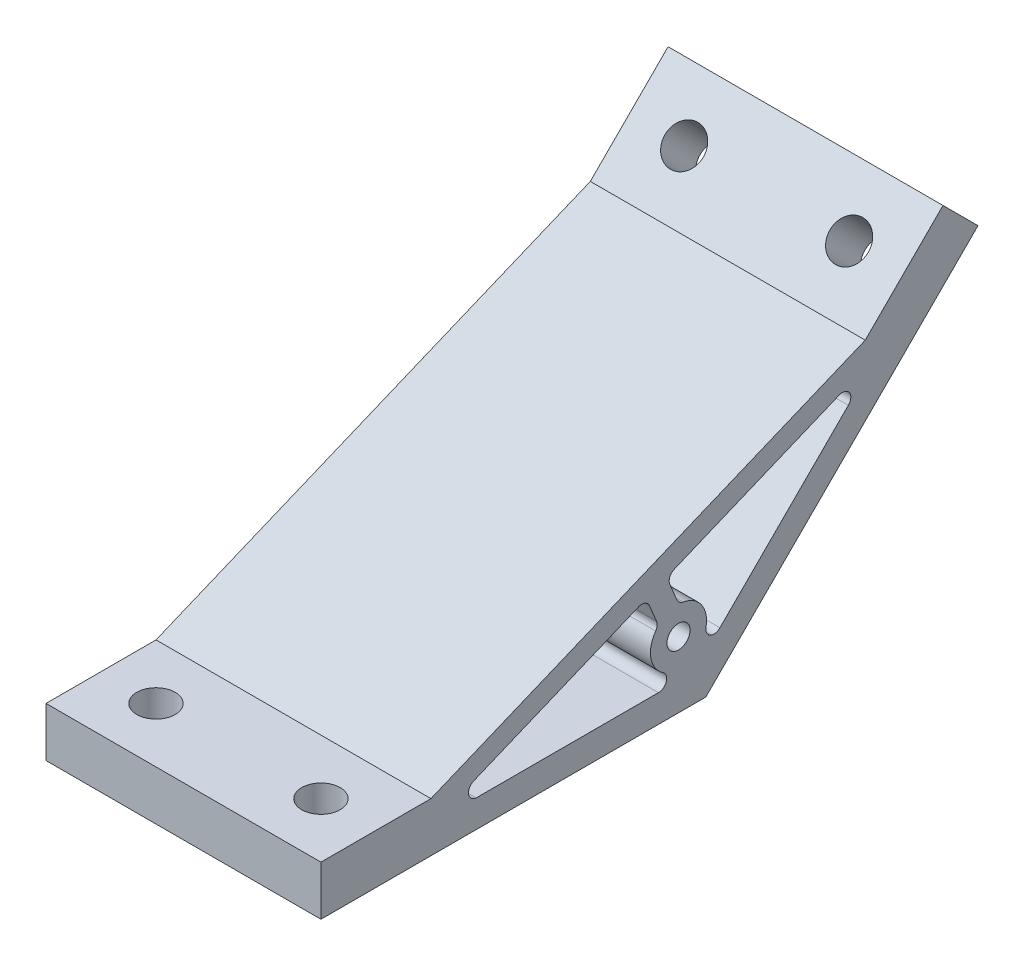
ISO-10303-21;
HEADER;
FILE_DESCRIPTION(('STEP AP214'),'2;1');
FILE_NAME('part.step','',(''),(''),'','','');
FILE_SCHEMA(('AUTOMOTIVE_DESIGN { 1 0 10303 214 1 1 1 1 }'));
ENDSEC;
DATA;
#1=APPLICATION_CONTEXT('core data for automotive mechanical design processes');
#2=APPLICATION_PROTOCOL_DEFINITION('international standard','automotive_design',2000,#1);
#3=PRODUCT_CONTEXT('',#1,'mechanical');
#4=PRODUCT('Part','Part','',(#3));
#5=PRODUCT_RELATED_PRODUCT_CATEGORY('part','',(#4));
#6=PRODUCT_DEFINITION_FORMATION('','',#4);
#7=PRODUCT_DEFINITION_CONTEXT('part definition',#1,'design');
#8=PRODUCT_DEFINITION('design','',#6,#7);
#9=PRODUCT_DEFINITION_SHAPE('','',#8);
#10=(LENGTH_UNIT() NAMED_UNIT(*) SI_UNIT(.MILLI.,.METRE.));
#11=(NAMED_UNIT(*) PLANE_ANGLE_UNIT() SI_UNIT($,.RADIAN.));
#12=(NAMED_UNIT(*) SI_UNIT($,.STERADIAN.) SOLID_ANGLE_UNIT());
#13=UNCERTAINTY_MEASURE_WITH_UNIT(LENGTH_MEASURE(1.E-05),#10,'distance_accuracy_value','');
#14=(GEOMETRIC_REPRESENTATION_CONTEXT(3) GLOBAL_UNCERTAINTY_ASSIGNED_CONTEXT((#13)) GLOBAL_UNIT_ASSIGNED_CONTEXT((#10,
#11,#12)) REPRESENTATION_CONTEXT('',''));
#15=CARTESIAN_POINT('',(0.,0.,0.));
#16=DIRECTION('',(0.,0.,1.));
#17=DIRECTION('',(1.,0.,0.));
#18=AXIS2_PLACEMENT_3D('',#15,#16,#17);
#19=CARTESIAN_POINT('',(25.,0.,0.));
#20=DIRECTION('',(0.,0.707106781186548,0.707106781186548));
#21=DIRECTION('',(0.,-0.707106781186548,0.707106781186548));
#22=AXIS2_PLACEMENT_3D('',#19,#20,#21);
#23=PLANE('',#22);
#24=CARTESIAN_POINT('',(15.,42.426406871193,-42.426406871193));
#25=DIRECTION('',(0.,0.707106781186548,0.707106781186548));
#26=DIRECTION('',(0.,-0.707106781186548,0.707106781186548));
#27=AXIS2_PLACEMENT_3D('',#24,#25,#26);
#28=CIRCLE('',#27,3.50000000000012);
#29=CARTESIAN_POINT('',(15.,39.95153313704,-39.95153313704));
#30=VERTEX_POINT('',#29);
#31=EDGE_CURVE('E481',#30,#30,#28,.T.);
#32=ORIENTED_EDGE('',*,*,#31,.T.);
#33=EDGE_LOOP('',(#32));
#34=FACE_BOUND('',#33,.T.);
#35=DIRECTION('',(-1.,0.,0.));
#36=VECTOR('',#35,1.);
#37=CARTESIAN_POINT('',(25.,0.,0.));
#38=LINE('',#37,#36);
#39=CARTESIAN_POINT('',(25.,0.,0.));
#40=VERTEX_POINT('',#39);
#41=CARTESIAN_POINT('',(-25.,0.,0.));
#42=VERTEX_POINT('',#41);
#43=EDGE_CURVE('E43',#40,#42,#38,.T.);
#44=ORIENTED_EDGE('',*,*,#43,.T.);
#45=DIRECTION('',(0.,0.707106781186548,-0.707106781186548));
#46=VECTOR('',#45,1.);
#47=CARTESIAN_POINT('',(-25.,0.,0.));
#48=LINE('',#47,#46);
#49=CARTESIAN_POINT('',(-25.,49.497474683058,-49.497474683058));
#50=VERTEX_POINT('',#49);
#51=EDGE_CURVE('E269',#42,#50,#48,.T.);
#52=ORIENTED_EDGE('',*,*,#51,.T.);
#53=DIRECTION('',(-1.,0.,0.));
#54=VECTOR('',#53,1.);
#55=CARTESIAN_POINT('',(25.,49.497474683058,-49.497474683058));
#56=LINE('',#55,#54);
#57=CARTESIAN_POINT('',(25.,49.497474683058,-49.497474683058));
#58=VERTEX_POINT('',#57);
#59=EDGE_CURVE('E367',#58,#50,#56,.T.);
#60=ORIENTED_EDGE('',*,*,#59,.F.);
#61=DIRECTION('',(0.,0.707106781186548,-0.707106781186548));
#62=VECTOR('',#61,1.);
#63=CARTESIAN_POINT('',(25.,0.,0.));
#64=LINE('',#63,#62);
#65=EDGE_CURVE('E349',#40,#58,#64,.T.);
#66=ORIENTED_EDGE('',*,*,#65,.F.);
#67=EDGE_LOOP('',(#44,#52,#60,#66));
#68=FACE_BOUND('',#67,.T.);
#69=CARTESIAN_POINT('',(-15.,42.426406871193,-42.426406871193));
#70=DIRECTION('',(0.,0.707106781186548,0.707106781186548));
#71=DIRECTION('',(0.,-0.707106781186548,0.707106781186548));
#72=AXIS2_PLACEMENT_3D('',#69,#70,#71);
#73=CIRCLE('',#72,3.50000000000012);
#74=CARTESIAN_POINT('',(-15.,39.95153313704,-39.95153313704));
#75=VERTEX_POINT('',#74);
#76=EDGE_CURVE('E486',#75,#75,#73,.T.);
#77=ORIENTED_EDGE('',*,*,#76,.T.);
#78=EDGE_LOOP('',(#77));
#79=FACE_BOUND('',#78,.T.);
#80=ADVANCED_FACE('F35',(#34,#68,#79),#23,.F.);
#81=CARTESIAN_POINT('',(25.,55.861435713737,-43.133513652379));
#82=DIRECTION('',(0.,-0.707106781186548,-0.707106781186547));
#83=DIRECTION('',(0.,0.707106781186547,-0.707106781186548));
#84=AXIS2_PLACEMENT_3D('',#81,#82,#83);
#85=PLANE('',#84);
#86=CARTESIAN_POINT('',(15.,48.790367901872,-36.062445840514));
#87=DIRECTION('',(0.,0.707106781186548,0.707106781186548));
#88=DIRECTION('',(0.,-0.707106781186548,0.707106781186548));
#89=AXIS2_PLACEMENT_3D('',#86,#87,#88);
#90=CIRCLE('',#89,3.50000000000012);
#91=CARTESIAN_POINT('',(15.,46.315494167719,-33.587572106361));
#92=VERTEX_POINT('',#91);
#93=EDGE_CURVE('E476',#92,#92,#90,.T.);
#94=ORIENTED_EDGE('',*,*,#93,.F.);
#95=EDGE_LOOP('',(#94));
#96=FACE_BOUND('',#95,.T.);
#97=DIRECTION('',(-1.,0.,0.));
#98=VECTOR('',#97,1.);
#99=CARTESIAN_POINT('',(25.,55.861435713737,-43.133513652379));
#100=LINE('',#99,#98);
#101=CARTESIAN_POINT('',(25.,55.861435713737,-43.133513652379));
#102=VERTEX_POINT('',#101);
#103=CARTESIAN_POINT('',(-25.,55.861435713737,-43.133513652379));
#104=VERTEX_POINT('',#103);
#105=EDGE_CURVE('E365',#102,#104,#100,.T.);
#106=ORIENTED_EDGE('',*,*,#105,.T.);
#107=DIRECTION('',(0.,-0.707106781186547,0.707106781186548));
#108=VECTOR('',#107,1.);
#109=CARTESIAN_POINT('',(-25.,55.861435713737,-43.133513652379));
#110=LINE('',#109,#108);
#111=CARTESIAN_POINT('',(-25.,41.719300090007,-28.991378028649));
#112=VERTEX_POINT('',#111);
#113=EDGE_CURVE('E275',#104,#112,#110,.T.);
#114=ORIENTED_EDGE('',*,*,#113,.T.);
#115=DIRECTION('',(-1.,0.,0.));
#116=VECTOR('',#115,1.);
#117=CARTESIAN_POINT('',(25.,41.719300090007,-28.991378028649));
#118=LINE('',#117,#116);
#119=CARTESIAN_POINT('',(25.,41.719300090007,-28.991378028649));
#120=VERTEX_POINT('',#119);
#121=EDGE_CURVE('E363',#120,#112,#118,.T.);
#122=ORIENTED_EDGE('',*,*,#121,.F.);
#123=DIRECTION('',(0.,-0.707106781186547,0.707106781186548));
#124=VECTOR('',#123,1.);
#125=CARTESIAN_POINT('',(25.,55.861435713737,-43.133513652379));
#126=LINE('',#125,#124);
#127=EDGE_CURVE('E353',#102,#120,#126,.T.);
#128=ORIENTED_EDGE('',*,*,#127,.F.);
#129=EDGE_LOOP('',(#106,#114,#122,#128));
#130=FACE_BOUND('',#129,.T.);
#131=CARTESIAN_POINT('',(-15.,48.790367901872,-36.062445840514));
#132=DIRECTION('',(0.,0.707106781186548,0.707106781186548));
#133=DIRECTION('',(0.,-0.707106781186548,0.707106781186548));
#134=AXIS2_PLACEMENT_3D('',#131,#132,#133);
#135=CIRCLE('',#134,3.50000000000012);
#136=CARTESIAN_POINT('',(-15.,46.315494167719,-33.587572106361));
#137=VERTEX_POINT('',#136);
#138=EDGE_CURVE('E483',#137,#137,#135,.T.);
#139=ORIENTED_EDGE('',*,*,#138,.F.);
#140=EDGE_LOOP('',(#139));
#141=FACE_BOUND('',#140,.T.);
#142=ADVANCED_FACE('F398',(#96,#130,#141),#85,.F.);
#143=CARTESIAN_POINT('',(25.,0.,70.));
#144=DIRECTION('',(0.,1.,0.));
#145=DIRECTION('',(0.,0.,1.));
#146=AXIS2_PLACEMENT_3D('',#143,#144,#145);
#147=PLANE('',#146);
#148=CARTESIAN_POINT('',(-15.,0.,60.));
#149=DIRECTION('',(0.,1.,0.));
#150=DIRECTION('',(0.,0.,1.));
#151=AXIS2_PLACEMENT_3D('',#148,#149,#150);
#152=CIRCLE('',#151,3.5);
#153=CARTESIAN_POINT('',(-15.,0.,63.5));
#154=VERTEX_POINT('',#153);
#155=EDGE_CURVE('E219',#154,#154,#152,.T.);
#156=ORIENTED_EDGE('',*,*,#155,.T.);
#157=EDGE_LOOP('',(#156));
#158=FACE_BOUND('',#157,.T.);
#159=DIRECTION('',(-1.,0.,0.));
#160=VECTOR('',#159,1.);
#161=CARTESIAN_POINT('',(25.,0.,70.));
#162=LINE('',#161,#160);
#163=CARTESIAN_POINT('',(25.,0.,70.));
#164=VERTEX_POINT('',#163);
#165=CARTESIAN_POINT('',(-25.,0.,70.));
#166=VERTEX_POINT('',#165);
#167=EDGE_CURVE('E11',#164,#166,#162,.T.);
#168=ORIENTED_EDGE('',*,*,#167,.T.);
#169=DIRECTION('',(0.,0.,-1.));
#170=VECTOR('',#169,1.);
#171=CARTESIAN_POINT('',(-25.,0.,70.));
#172=LINE('',#171,#170);
#173=EDGE_CURVE('E266',#166,#42,#172,.T.);
#174=ORIENTED_EDGE('',*,*,#173,.T.);
#175=ORIENTED_EDGE('',*,*,#43,.F.);
#176=DIRECTION('',(0.,0.,-1.));
#177=VECTOR('',#176,1.);
#178=CARTESIAN_POINT('',(25.,0.,70.));
#179=LINE('',#178,#177);
#180=EDGE_CURVE('E347',#164,#40,#179,.T.);
#181=ORIENTED_EDGE('',*,*,#180,.F.);
#182=EDGE_LOOP('',(#168,#174,#175,#181));
#183=FACE_BOUND('',#182,.T.);
#184=CARTESIAN_POINT('',(15.,0.,60.));
#185=DIRECTION('',(0.,1.,0.));
#186=DIRECTION('',(0.,0.,1.));
#187=AXIS2_PLACEMENT_3D('',#184,#185,#186);
#188=CIRCLE('',#187,3.5);
#189=CARTESIAN_POINT('',(15.,0.,63.5));
#190=VERTEX_POINT('',#189);
#191=EDGE_CURVE('E471',#190,#190,#188,.T.);
#192=ORIENTED_EDGE('',*,*,#191,.T.);
#193=EDGE_LOOP('',(#192));
#194=FACE_BOUND('',#193,.T.);
#195=ADVANCED_FACE('F380',(#158,#183,#194),#147,.F.);
#196=CARTESIAN_POINT('',(25.,9.0000000000001,49.991379634898));
#197=DIRECTION('',(0.,-1.,0.));
#198=DIRECTION('',(0.,0.,-1.));
#199=AXIS2_PLACEMENT_3D('',#196,#197,#198);
#200=PLANE('',#199);
#201=CARTESIAN_POINT('',(-15.,9.,60.));
#202=DIRECTION('',(0.,1.,0.));
#203=DIRECTION('',(0.,0.,1.));
#204=AXIS2_PLACEMENT_3D('',#201,#202,#203);
#205=CIRCLE('',#204,3.5);
#206=CARTESIAN_POINT('',(-15.,9.,63.5));
#207=VERTEX_POINT('',#206);
#208=EDGE_CURVE('E216',#207,#207,#205,.T.);
#209=ORIENTED_EDGE('',*,*,#208,.F.);
#210=EDGE_LOOP('',(#209));
#211=FACE_BOUND('',#210,.T.);
#212=DIRECTION('',(-1.,0.,0.));
#213=VECTOR('',#212,1.);
#214=CARTESIAN_POINT('',(25.,9.0000000000001,49.991379634898));
#215=LINE('',#214,#213);
#216=CARTESIAN_POINT('',(25.,9.0000000000001,49.991379634898));
#217=VERTEX_POINT('',#216);
#218=CARTESIAN_POINT('',(-25.,9.0000000000001,49.991379634898));
#219=VERTEX_POINT('',#218);
#220=EDGE_CURVE('E361',#217,#219,#215,.T.);
#221=ORIENTED_EDGE('',*,*,#220,.T.);
#222=DIRECTION('',(0.,0.,1.));
#223=VECTOR('',#222,1.);
#224=CARTESIAN_POINT('',(-25.,9.0000000000001,49.991379634898));
#225=LINE('',#224,#223);
#226=CARTESIAN_POINT('',(-25.,9.0000000000001,70.));
#227=VERTEX_POINT('',#226);
#228=EDGE_CURVE('E281',#219,#227,#225,.T.);
#229=ORIENTED_EDGE('',*,*,#228,.T.);
#230=DIRECTION('',(-1.,0.,0.));
#231=VECTOR('',#230,1.);
#232=CARTESIAN_POINT('',(25.,9.0000000000001,70.));
#233=LINE('',#232,#231);
#234=CARTESIAN_POINT('',(25.,9.0000000000001,70.));
#235=VERTEX_POINT('',#234);
#236=EDGE_CURVE('E359',#235,#227,#233,.T.);
#237=ORIENTED_EDGE('',*,*,#236,.F.);
#238=DIRECTION('',(0.,0.,1.));
#239=VECTOR('',#238,1.);
#240=CARTESIAN_POINT('',(25.,9.0000000000001,49.991379634898));
#241=LINE('',#240,#239);
#242=EDGE_CURVE('E357',#217,#235,#241,.T.);
#243=ORIENTED_EDGE('',*,*,#242,.F.);
#244=EDGE_LOOP('',(#221,#229,#237,#243));
#245=FACE_BOUND('',#244,.T.);
#246=CARTESIAN_POINT('',(15.,9.,60.));
#247=DIRECTION('',(0.,1.,0.));
#248=DIRECTION('',(0.,0.,1.));
#249=AXIS2_PLACEMENT_3D('',#246,#247,#248);
#250=CIRCLE('',#249,3.5);
#251=CARTESIAN_POINT('',(15.,9.,63.5));
#252=VERTEX_POINT('',#251);
#253=EDGE_CURVE('E469',#252,#252,#250,.T.);
#254=ORIENTED_EDGE('',*,*,#253,.F.);
#255=EDGE_LOOP('',(#254));
#256=FACE_BOUND('',#255,.T.);
#257=ADVANCED_FACE('F389',(#211,#245,#256),#200,.F.);
#258=CARTESIAN_POINT('',(25.,0.,0.));
#259=DIRECTION('',(1.,0.,0.));
#260=DIRECTION('',(0.,0.,-1.));
#261=AXIS2_PLACEMENT_3D('',#258,#259,#260);
#262=PLANE('',#261);
#263=CARTESIAN_POINT('',(25.,12.0000000000009,4.97056274847582));
#264=DIRECTION('',(1.,0.,0.));
#265=DIRECTION('',(0.,0.,-1.));
#266=AXIS2_PLACEMENT_3D('',#263,#264,#265);
#267=CIRCLE('',#266,2.09999999999872);
#268=CARTESIAN_POINT('',(25.,12.0000000000009,2.8705627484771));
#269=VERTEX_POINT('',#268);
#270=EDGE_CURVE('E200',#269,#269,#267,.T.);
#271=ORIENTED_EDGE('',*,*,#270,.F.);
#272=EDGE_LOOP('',(#271));
#273=FACE_BOUND('',#272,.T.);
#274=DIRECTION('',(0.,-1.,0.));
#275=VECTOR('',#274,1.);
#276=CARTESIAN_POINT('',(25.,9.0000000000001,70.));
#277=LINE('',#276,#275);
#278=EDGE_CURVE('E344',#235,#164,#277,.T.);
#279=ORIENTED_EDGE('',*,*,#278,.T.);
#280=ORIENTED_EDGE('',*,*,#180,.T.);
#281=ORIENTED_EDGE('',*,*,#65,.T.);
#282=DIRECTION('',(0.,0.707106781186548,0.707106781186547));
#283=VECTOR('',#282,1.);
#284=CARTESIAN_POINT('',(25.,49.497474683058,-49.497474683058));
#285=LINE('',#284,#283);
#286=EDGE_CURVE('E351',#58,#102,#285,.T.);
#287=ORIENTED_EDGE('',*,*,#286,.T.);
#288=ORIENTED_EDGE('',*,*,#127,.T.);
#289=DIRECTION('',(0.,-0.382719081853924,0.923864765203701));
#290=VECTOR('',#289,1.);
#291=CARTESIAN_POINT('',(25.,41.719300090007,-28.991378028649));
#292=LINE('',#291,#290);
#293=EDGE_CURVE('E355',#120,#217,#292,.T.);
#294=ORIENTED_EDGE('',*,*,#293,.T.);
#295=ORIENTED_EDGE('',*,*,#242,.T.);
#296=EDGE_LOOP('',(#279,#280,#281,#287,#288,#294,#295));
#297=FACE_BOUND('',#296,.T.);
#298=DIRECTION('',(0.,-0.923879532511293,-0.382683432365075));
#299=VECTOR('',#298,1.);
#300=CARTESIAN_POINT('',(25.,21.043679480921,6.5517930426452));
#301=LINE('',#300,#299);
#302=CARTESIAN_POINT('',(25.,21.043679480921,6.5517930426452));
#303=VERTEX_POINT('',#302);
#304=CARTESIAN_POINT('',(25.,17.934966139289,5.2641218150111));
#305=VERTEX_POINT('',#304);
#306=EDGE_CURVE('E315',#303,#305,#301,.T.);
#307=ORIENTED_EDGE('',*,*,#306,.F.);
#308=CARTESIAN_POINT('',(25.,21.617704629469,5.16597374387834));
#309=DIRECTION('',(1.,0.,0.));
#310=DIRECTION('',(0.,0.,-1.));
#311=AXIS2_PLACEMENT_3D('',#308,#309,#310);
#312=CIRCLE('',#311,1.50000000000007);
#313=CARTESIAN_POINT('',(25.,23.003523928236,5.739998892426));
#314=VERTEX_POINT('',#313);
#315=EDGE_CURVE('E313',#314,#303,#312,.T.);
#316=ORIENTED_EDGE('',*,*,#315,.F.);
#317=DIRECTION('',(0.,-0.382683432365076,0.923879532511293));
#318=VECTOR('',#317,1.);
#319=CARTESIAN_POINT('',(25.,35.442444531149,-24.29021192841));
#320=LINE('',#319,#318);
#321=CARTESIAN_POINT('',(25.,35.442444531149,-24.29021192841));
#322=VERTEX_POINT('',#321);
#323=EDGE_CURVE('E327',#322,#314,#320,.T.);
#324=ORIENTED_EDGE('',*,*,#323,.F.);
#325=CARTESIAN_POINT('',(25.,34.0566252323827,-24.8642370769577));
#326=DIRECTION('',(1.,0.,0.));
#327=DIRECTION('',(0.,0.,-1.));
#328=AXIS2_PLACEMENT_3D('',#325,#326,#327);
#329=CIRCLE('',#328,1.49999999999949);
#330=CARTESIAN_POINT('',(25.,32.995965060603,-25.924897248737));
#331=VERTEX_POINT('',#330);
#332=EDGE_CURVE('E325',#331,#322,#329,.T.);
#333=ORIENTED_EDGE('',*,*,#332,.F.);
#334=DIRECTION('',(0.,0.707106781186557,-0.707106781186538));
#335=VECTOR('',#334,1.);
#336=CARTESIAN_POINT('',(25.,9.6299811996021,-2.5589133877367));
#337=LINE('',#336,#335);
#338=CARTESIAN_POINT('',(25.,9.6299811996021,-2.5589133877367));
#339=VERTEX_POINT('',#338);
#340=EDGE_CURVE('E323',#339,#331,#337,.T.);
#341=ORIENTED_EDGE('',*,*,#340,.F.);
#342=CARTESIAN_POINT('',(25.,10.6906413713782,-1.49825321595333));
#343=DIRECTION('',(1.,0.,0.));
#344=DIRECTION('',(0.,0.,-1.));
#345=AXIS2_PLACEMENT_3D('',#342,#343,#344);
#346=CIRCLE('',#345,1.4999999999999);
#347=CARTESIAN_POINT('',(25.,10.988222877886,-0.0280677694928335));
#348=VERTEX_POINT('',#347);
#349=EDGE_CURVE('E321',#348,#339,#346,.T.);
#350=ORIENTED_EDGE('',*,*,#349,.F.);
#351=CARTESIAN_POINT('',(25.,12.0000000000009,4.97056274847582));
#352=DIRECTION('',(-1.,0.,0.));
#353=DIRECTION('',(0.,0.,1.));
#354=AXIS2_PLACEMENT_3D('',#351,#352,#353);
#355=CIRCLE('',#354,5.10000000000026);
#356=CARTESIAN_POINT('',(25.,17.029675086054,4.1265434781155));
#357=VERTEX_POINT('',#356);
#358=EDGE_CURVE('E319',#357,#348,#355,.T.);
#359=ORIENTED_EDGE('',*,*,#358,.F.);
#360=CARTESIAN_POINT('',(25.,18.5089912878329,3.87830251624389));
#361=DIRECTION('',(1.,0.,0.));
#362=DIRECTION('',(0.,0.,-1.));
#363=AXIS2_PLACEMENT_3D('',#360,#361,#362);
#364=CIRCLE('',#363,1.49999999999882);
#365=EDGE_CURVE('E317',#305,#357,#364,.T.);
#366=ORIENTED_EDGE('',*,*,#365,.F.);
#367=EDGE_LOOP('',(#307,#316,#324,#333,#341,#350,#359,#366));
#368=FACE_BOUND('',#367,.T.);
#369=DIRECTION('',(0.,-8.63347131464353E-05,-0.999999996273159));
#370=VECTOR('',#369,1.);
#371=CARTESIAN_POINT('',(25.,5.00286088114,41.755939665809));
#372=LINE('',#371,#370);
#373=CARTESIAN_POINT('',(25.,5.00286088114,41.755939665809));
#374=VERTEX_POINT('',#373);
#375=CARTESIAN_POINT('',(25.,5.0000000111806,8.6189795199452));
#376=VERTEX_POINT('',#375);
#377=EDGE_CURVE('E285',#374,#376,#372,.T.);
#378=ORIENTED_EDGE('',*,*,#377,.F.);
#379=CARTESIAN_POINT('',(25.,6.49999999894205,41.6633412751829));
#380=DIRECTION('',(1.,0.,0.));
#381=DIRECTION('',(0.,0.,-1.));
#382=AXIS2_PLACEMENT_3D('',#379,#380,#381);
#383=CIRCLE('',#382,1.49999999999988);
#384=CARTESIAN_POINT('',(25.,7.8858767775071,42.237227635566));
#385=VERTEX_POINT('',#384);
#386=EDGE_CURVE('E197',#385,#374,#383,.T.);
#387=ORIENTED_EDGE('',*,*,#386,.F.);
#388=DIRECTION('',(0.,-0.382590897435052,0.923917856305333));
#389=VECTOR('',#388,1.);
#390=CARTESIAN_POINT('',(25.,20.359579109558,12.114513279102));
#391=LINE('',#390,#389);
#392=CARTESIAN_POINT('',(25.,20.359579109558,12.114513279102));
#393=VERTEX_POINT('',#392);
#394=EDGE_CURVE('E297',#393,#385,#391,.T.);
#395=ORIENTED_EDGE('',*,*,#394,.F.);
#396=CARTESIAN_POINT('',(25.,18.9389206029112,11.6331304714574));
#397=DIRECTION('',(1.,0.,0.));
#398=DIRECTION('',(0.,0.,-1.));
#399=AXIS2_PLACEMENT_3D('',#396,#397,#398);
#400=CIRCLE('',#399,1.50000000000124);
#401=CARTESIAN_POINT('',(25.,19.512945751461,10.24731117269));
#402=VERTEX_POINT('',#401);
#403=EDGE_CURVE('E295',#402,#393,#400,.T.);
#404=ORIENTED_EDGE('',*,*,#403,.F.);
#405=DIRECTION('',(0.,0.923879532511346,0.382683432364948));
#406=VECTOR('',#405,1.);
#407=CARTESIAN_POINT('',(25.,16.404232409829,8.9596399450564));
#408=LINE('',#407,#406);
#409=CARTESIAN_POINT('',(25.,16.404232409829,8.9596399450564));
#410=VERTEX_POINT('',#409);
#411=EDGE_CURVE('E293',#410,#402,#408,.T.);
#412=ORIENTED_EDGE('',*,*,#411,.F.);
#413=CARTESIAN_POINT('',(25.,15.8302072612781,10.3454592438224));
#414=DIRECTION('',(1.,0.,0.));
#415=DIRECTION('',(0.,0.,-1.));
#416=AXIS2_PLACEMENT_3D('',#413,#414,#415);
#417=CIRCLE('',#416,1.50000000000034);
#418=CARTESIAN_POINT('',(25.,14.959705610989,9.1238918585157));
#419=VERTEX_POINT('',#418);
#420=EDGE_CURVE('E291',#419,#410,#417,.T.);
#421=ORIENTED_EDGE('',*,*,#420,.F.);
#422=CARTESIAN_POINT('',(25.,11.9999766586759,4.97057938184809));
#423=DIRECTION('',(-1.,0.,0.));
#424=DIRECTION('',(0.,0.,1.));
#425=AXIS2_PLACEMENT_3D('',#422,#423,#424);
#426=CIRCLE('',#425,5.10000000000032);
#427=CARTESIAN_POINT('',(25.,7.7563640518819,7.7993162100918));
#428=VERTEX_POINT('',#427);
#429=EDGE_CURVE('E289',#428,#419,#426,.T.);
#430=ORIENTED_EDGE('',*,*,#429,.F.);
#431=CARTESIAN_POINT('',(25.,6.50000000012096,8.61879736877877));
#432=DIRECTION('',(1.,0.,0.));
#433=DIRECTION('',(0.,0.,-1.));
#434=AXIS2_PLACEMENT_3D('',#431,#432,#433);
#435=CIRCLE('',#434,1.50000000000004);
#436=EDGE_CURVE('E287',#376,#428,#435,.T.);
#437=ORIENTED_EDGE('',*,*,#436,.F.);
#438=EDGE_LOOP('',(#378,#387,#395,#404,#412,#421,#430,#437));
#439=FACE_BOUND('',#438,.T.);
#440=ADVANCED_FACE('F406',(#273,#297,#368,#439),#262,.T.);
#441=CARTESIAN_POINT('',(25.,9.0000000000001,70.));
#442=DIRECTION('',(0.,0.,-1.));
#443=DIRECTION('',(-1.,0.,0.));
#444=AXIS2_PLACEMENT_3D('',#441,#442,#443);
#445=PLANE('',#444);
#446=ORIENTED_EDGE('',*,*,#236,.T.);
#447=DIRECTION('',(0.,-1.,0.));
#448=VECTOR('',#447,1.);
#449=CARTESIAN_POINT('',(-25.,9.0000000000001,70.));
#450=LINE('',#449,#448);
#451=EDGE_CURVE('E263',#227,#166,#450,.T.);
#452=ORIENTED_EDGE('',*,*,#451,.T.);
#453=ORIENTED_EDGE('',*,*,#167,.F.);
#454=ORIENTED_EDGE('',*,*,#278,.F.);
#455=EDGE_LOOP('',(#446,#452,#453,#454));
#456=FACE_BOUND('',#455,.T.);
#457=ADVANCED_FACE('F37',(#456),#445,.F.);
#458=CARTESIAN_POINT('',(25.,49.497474683058,-49.497474683058));
#459=DIRECTION('',(0.,-0.707106781186547,0.707106781186548));
#460=DIRECTION('',(0.,-0.707106781186548,-0.707106781186547));
#461=AXIS2_PLACEMENT_3D('',#458,#459,#460);
#462=PLANE('',#461);
#463=ORIENTED_EDGE('',*,*,#59,.T.);
#464=DIRECTION('',(0.,0.707106781186548,0.707106781186547));
#465=VECTOR('',#464,1.);
#466=CARTESIAN_POINT('',(-25.,49.497474683058,-49.497474683058));
#467=LINE('',#466,#465);
#468=EDGE_CURVE('E272',#50,#104,#467,.T.);
#469=ORIENTED_EDGE('',*,*,#468,.T.);
#470=ORIENTED_EDGE('',*,*,#105,.F.);
#471=ORIENTED_EDGE('',*,*,#286,.F.);
#472=EDGE_LOOP('',(#463,#469,#470,#471));
#473=FACE_BOUND('',#472,.T.);
#474=ADVANCED_FACE('F404',(#473),#462,.F.);
#475=CARTESIAN_POINT('',(25.,41.719300090007,-28.991378028649));
#476=DIRECTION('',(0.,-0.923864765203701,-0.382719081853924));
#477=DIRECTION('',(0.,0.382719081853924,-0.923864765203701));
#478=AXIS2_PLACEMENT_3D('',#475,#476,#477);
#479=PLANE('',#478);
#480=ORIENTED_EDGE('',*,*,#121,.T.);
#481=DIRECTION('',(0.,-0.382719081853924,0.923864765203701));
#482=VECTOR('',#481,1.);
#483=CARTESIAN_POINT('',(-25.,41.719300090007,-28.991378028649));
#484=LINE('',#483,#482);
#485=EDGE_CURVE('E278',#112,#219,#484,.T.);
#486=ORIENTED_EDGE('',*,*,#485,.T.);
#487=ORIENTED_EDGE('',*,*,#220,.F.);
#488=ORIENTED_EDGE('',*,*,#293,.F.);
#489=EDGE_LOOP('',(#480,#486,#487,#488));
#490=FACE_BOUND('',#489,.T.);
#491=ADVANCED_FACE('F395',(#490),#479,.F.);
#492=CARTESIAN_POINT('',(25.,21.617704629469,5.16597374387834));
#493=DIRECTION('',(-1.,0.,0.));
#494=DIRECTION('',(0.,0.,1.));
#495=AXIS2_PLACEMENT_3D('',#492,#493,#494);
#496=CYLINDRICAL_SURFACE('',#495,1.50000000000007);
#497=DIRECTION('',(-1.,0.,0.));
#498=VECTOR('',#497,1.);
#499=CARTESIAN_POINT('',(25.,21.043679480921,6.5517930426452));
#500=LINE('',#499,#498);
#501=CARTESIAN_POINT('',(-25.,21.043679480921,6.5517930426452));
#502=VERTEX_POINT('',#501);
#503=EDGE_CURVE('E342',#303,#502,#500,.T.);
#504=ORIENTED_EDGE('',*,*,#503,.T.);
#505=CARTESIAN_POINT('',(-25.,21.617704629469,5.16597374387834));
#506=DIRECTION('',(1.,0.,0.));
#507=DIRECTION('',(0.,0.,-1.));
#508=AXIS2_PLACEMENT_3D('',#505,#506,#507);
#509=CIRCLE('',#508,1.50000000000007);
#510=CARTESIAN_POINT('',(-25.,23.003523928236,5.739998892426));
#511=VERTEX_POINT('',#510);
#512=EDGE_CURVE('E239',#511,#502,#509,.T.);
#513=ORIENTED_EDGE('',*,*,#512,.F.);
#514=DIRECTION('',(-1.,0.,0.));
#515=VECTOR('',#514,1.);
#516=CARTESIAN_POINT('',(25.,23.003523928236,5.739998892426));
#517=LINE('',#516,#515);
#518=EDGE_CURVE('E329',#314,#511,#517,.T.);
#519=ORIENTED_EDGE('',*,*,#518,.F.);
#520=ORIENTED_EDGE('',*,*,#315,.T.);
#521=EDGE_LOOP('',(#504,#513,#519,#520));
#522=FACE_BOUND('',#521,.T.);
#523=ADVANCED_FACE('F577',(#522),#496,.F.);
#524=CARTESIAN_POINT('',(25.,21.043679480921,6.5517930426452));
#525=DIRECTION('',(0.,0.382683432365075,-0.923879532511293));
#526=DIRECTION('',(0.,0.923879532511293,0.382683432365075));
#527=AXIS2_PLACEMENT_3D('',#524,#525,#526);
#528=PLANE('',#527);
#529=DIRECTION('',(-1.,0.,0.));
#530=VECTOR('',#529,1.);
#531=CARTESIAN_POINT('',(25.,17.934966139289,5.2641218150111));
#532=LINE('',#531,#530);
#533=CARTESIAN_POINT('',(-25.,17.934966139289,5.2641218150111));
#534=VERTEX_POINT('',#533);
#535=EDGE_CURVE('E340',#305,#534,#532,.T.);
#536=ORIENTED_EDGE('',*,*,#535,.T.);
#537=DIRECTION('',(0.,-0.923879532511293,-0.382683432365075));
#538=VECTOR('',#537,1.);
#539=CARTESIAN_POINT('',(-25.,21.043679480921,6.5517930426452));
#540=LINE('',#539,#538);
#541=EDGE_CURVE('E242',#502,#534,#540,.T.);
#542=ORIENTED_EDGE('',*,*,#541,.F.);
#543=ORIENTED_EDGE('',*,*,#503,.F.);
#544=ORIENTED_EDGE('',*,*,#306,.T.);
#545=EDGE_LOOP('',(#536,#542,#543,#544));
#546=FACE_BOUND('',#545,.T.);
#547=ADVANCED_FACE('F584',(#546),#528,.T.);
#548=CARTESIAN_POINT('',(25.,18.5089912878329,3.87830251624389));
#549=DIRECTION('',(-1.,0.,0.));
#550=DIRECTION('',(0.,0.,1.));
#551=AXIS2_PLACEMENT_3D('',#548,#549,#550);
#552=CYLINDRICAL_SURFACE('',#551,1.49999999999882);
#553=DIRECTION('',(-1.,0.,0.));
#554=VECTOR('',#553,1.);
#555=CARTESIAN_POINT('',(25.,17.029675086054,4.1265434781155));
#556=LINE('',#555,#554);
#557=CARTESIAN_POINT('',(-25.,17.029675086054,4.1265434781155));
#558=VERTEX_POINT('',#557);
#559=EDGE_CURVE('E338',#357,#558,#556,.T.);
#560=ORIENTED_EDGE('',*,*,#559,.T.);
#561=CARTESIAN_POINT('',(-25.,18.5089912878329,3.87830251624389));
#562=DIRECTION('',(1.,0.,0.));
#563=DIRECTION('',(0.,0.,-1.));
#564=AXIS2_PLACEMENT_3D('',#561,#562,#563);
#565=CIRCLE('',#564,1.49999999999882);
#566=EDGE_CURVE('E245',#534,#558,#565,.T.);
#567=ORIENTED_EDGE('',*,*,#566,.F.);
#568=ORIENTED_EDGE('',*,*,#535,.F.);
#569=ORIENTED_EDGE('',*,*,#365,.T.);
#570=EDGE_LOOP('',(#560,#567,#568,#569));
#571=FACE_BOUND('',#570,.T.);
#572=ADVANCED_FACE('F592',(#571),#552,.F.);
#573=CARTESIAN_POINT('',(25.,12.0000000000009,4.97056274847582));
#574=DIRECTION('',(-1.,0.,0.));
#575=DIRECTION('',(0.,0.,1.));
#576=AXIS2_PLACEMENT_3D('',#573,#574,#575);
#577=CYLINDRICAL_SURFACE('',#576,5.10000000000026);
#578=DIRECTION('',(-1.,0.,0.));
#579=VECTOR('',#578,1.);
#580=CARTESIAN_POINT('',(25.,10.988222877886,-0.0280677694928335));
#581=LINE('',#580,#579);
#582=CARTESIAN_POINT('',(-25.,10.988222877886,-0.0280677694928335));
#583=VERTEX_POINT('',#582);
#584=EDGE_CURVE('E336',#348,#583,#581,.T.);
#585=ORIENTED_EDGE('',*,*,#584,.T.);
#586=CARTESIAN_POINT('',(-25.,12.0000000000009,4.97056274847582));
#587=DIRECTION('',(-1.,0.,0.));
#588=DIRECTION('',(0.,0.,1.));
#589=AXIS2_PLACEMENT_3D('',#586,#587,#588);
#590=CIRCLE('',#589,5.10000000000026);
#591=EDGE_CURVE('E248',#558,#583,#590,.T.);
#592=ORIENTED_EDGE('',*,*,#591,.F.);
#593=ORIENTED_EDGE('',*,*,#559,.F.);
#594=ORIENTED_EDGE('',*,*,#358,.T.);
#595=EDGE_LOOP('',(#585,#592,#593,#594));
#596=FACE_BOUND('',#595,.T.);
#597=ADVANCED_FACE('F600',(#596),#577,.T.);
#598=CARTESIAN_POINT('',(25.,10.6906413713782,-1.49825321595333));
#599=DIRECTION('',(-1.,0.,0.));
#600=DIRECTION('',(0.,0.,1.));
#601=AXIS2_PLACEMENT_3D('',#598,#599,#600);
#602=CYLINDRICAL_SURFACE('',#601,1.4999999999999);
#603=DIRECTION('',(-1.,0.,0.));
#604=VECTOR('',#603,1.);
#605=CARTESIAN_POINT('',(25.,9.6299811996021,-2.5589133877367));
#606=LINE('',#605,#604);
#607=CARTESIAN_POINT('',(-25.,9.6299811996021,-2.5589133877367));
#608=VERTEX_POINT('',#607);
#609=EDGE_CURVE('E334',#339,#608,#606,.T.);
#610=ORIENTED_EDGE('',*,*,#609,.T.);
#611=CARTESIAN_POINT('',(-25.,10.6906413713782,-1.49825321595333));
#612=DIRECTION('',(1.,0.,0.));
#613=DIRECTION('',(0.,0.,-1.));
#614=AXIS2_PLACEMENT_3D('',#611,#612,#613);
#615=CIRCLE('',#614,1.4999999999999);
#616=EDGE_CURVE('E251',#583,#608,#615,.T.);
#617=ORIENTED_EDGE('',*,*,#616,.F.);
#618=ORIENTED_EDGE('',*,*,#584,.F.);
#619=ORIENTED_EDGE('',*,*,#349,.T.);
#620=EDGE_LOOP('',(#610,#617,#618,#619));
#621=FACE_BOUND('',#620,.T.);
#622=ADVANCED_FACE('F608',(#621),#602,.F.);
#623=CARTESIAN_POINT('',(25.,9.6299811996021,-2.5589133877367));
#624=DIRECTION('',(0.,0.707106781186538,0.707106781186557));
#625=DIRECTION('',(0.,-0.707106781186557,0.707106781186538));
#626=AXIS2_PLACEMENT_3D('',#623,#624,#625);
#627=PLANE('',#626);
#628=DIRECTION('',(-1.,0.,0.));
#629=VECTOR('',#628,1.);
#630=CARTESIAN_POINT('',(25.,32.995965060603,-25.924897248737));
#631=LINE('',#630,#629);
#632=CARTESIAN_POINT('',(-25.,32.995965060603,-25.924897248737));
#633=VERTEX_POINT('',#632);
#634=EDGE_CURVE('E332',#331,#633,#631,.T.);
#635=ORIENTED_EDGE('',*,*,#634,.T.);
#636=DIRECTION('',(0.,0.707106781186557,-0.707106781186538));
#637=VECTOR('',#636,1.);
#638=CARTESIAN_POINT('',(-25.,9.6299811996021,-2.5589133877367));
#639=LINE('',#638,#637);
#640=EDGE_CURVE('E254',#608,#633,#639,.T.);
#641=ORIENTED_EDGE('',*,*,#640,.F.);
#642=ORIENTED_EDGE('',*,*,#609,.F.);
#643=ORIENTED_EDGE('',*,*,#340,.T.);
#644=EDGE_LOOP('',(#635,#641,#642,#643));
#645=FACE_BOUND('',#644,.T.);
#646=ADVANCED_FACE('F616',(#645),#627,.T.);
#647=CARTESIAN_POINT('',(25.,34.0566252323827,-24.8642370769577));
#648=DIRECTION('',(-1.,0.,0.));
#649=DIRECTION('',(0.,0.,1.));
#650=AXIS2_PLACEMENT_3D('',#647,#648,#649);
#651=CYLINDRICAL_SURFACE('',#650,1.49999999999949);
#652=DIRECTION('',(-1.,0.,0.));
#653=VECTOR('',#652,1.);
#654=CARTESIAN_POINT('',(25.,35.442444531149,-24.29021192841));
#655=LINE('',#654,#653);
#656=CARTESIAN_POINT('',(-25.,35.442444531149,-24.29021192841));
#657=VERTEX_POINT('',#656);
#658=EDGE_CURVE('E58',#322,#657,#655,.T.);
#659=ORIENTED_EDGE('',*,*,#658,.T.);
#660=CARTESIAN_POINT('',(-25.,34.0566252323827,-24.8642370769577));
#661=DIRECTION('',(1.,0.,0.));
#662=DIRECTION('',(0.,0.,-1.));
#663=AXIS2_PLACEMENT_3D('',#660,#661,#662);
#664=CIRCLE('',#663,1.49999999999949);
#665=EDGE_CURVE('E257',#633,#657,#664,.T.);
#666=ORIENTED_EDGE('',*,*,#665,.F.);
#667=ORIENTED_EDGE('',*,*,#634,.F.);
#668=ORIENTED_EDGE('',*,*,#332,.T.);
#669=EDGE_LOOP('',(#659,#666,#667,#668));
#670=FACE_BOUND('',#669,.T.);
#671=ADVANCED_FACE('F624',(#670),#651,.F.);
#672=CARTESIAN_POINT('',(25.,35.442444531149,-24.29021192841));
#673=DIRECTION('',(0.,-0.923879532511293,-0.382683432365076));
#674=DIRECTION('',(0.,0.382683432365076,-0.923879532511293));
#675=AXIS2_PLACEMENT_3D('',#672,#673,#674);
#676=PLANE('',#675);
#677=ORIENTED_EDGE('',*,*,#518,.T.);
#678=DIRECTION('',(0.,-0.382683432365076,0.923879532511293));
#679=VECTOR('',#678,1.);
#680=CARTESIAN_POINT('',(-25.,35.442444531149,-24.29021192841));
#681=LINE('',#680,#679);
#682=EDGE_CURVE('E260',#657,#511,#681,.T.);
#683=ORIENTED_EDGE('',*,*,#682,.F.);
#684=ORIENTED_EDGE('',*,*,#658,.F.);
#685=ORIENTED_EDGE('',*,*,#323,.T.);
#686=EDGE_LOOP('',(#677,#683,#684,#685));
#687=FACE_BOUND('',#686,.T.);
#688=ADVANCED_FACE('F632',(#687),#676,.T.);
#689=CARTESIAN_POINT('',(25.,12.0000000000009,4.97056274847582));
#690=DIRECTION('',(-1.,0.,0.));
#691=DIRECTION('',(0.,0.,1.));
#692=AXIS2_PLACEMENT_3D('',#689,#690,#691);
#693=CYLINDRICAL_SURFACE('',#692,2.09999999999872);
#694=ORIENTED_EDGE('',*,*,#270,.T.);
#695=EDGE_LOOP('',(#694));
#696=FACE_BOUND('',#695,.T.);
#697=CARTESIAN_POINT('',(-25.,12.0000000000009,4.97056274847582));
#698=DIRECTION('',(1.,0.,0.));
#699=DIRECTION('',(0.,0.,-1.));
#700=AXIS2_PLACEMENT_3D('',#697,#698,#699);
#701=CIRCLE('',#700,2.09999999999872);
#702=CARTESIAN_POINT('',(-25.,12.0000000000009,2.8705627484771));
#703=VERTEX_POINT('',#702);
#704=EDGE_CURVE('E236',#703,#703,#701,.T.);
#705=ORIENTED_EDGE('',*,*,#704,.F.);
#706=EDGE_LOOP('',(#705));
#707=FACE_BOUND('',#706,.T.);
#708=ADVANCED_FACE('F640',(#696,#707),#693,.F.);
#709=CARTESIAN_POINT('',(25.,6.49999999894205,41.6633412751829));
#710=DIRECTION('',(-1.,0.,0.));
#711=DIRECTION('',(0.,0.,1.));
#712=AXIS2_PLACEMENT_3D('',#709,#710,#711);
#713=CYLINDRICAL_SURFACE('',#712,1.49999999999988);
#714=DIRECTION('',(-1.,0.,0.));
#715=VECTOR('',#714,1.);
#716=CARTESIAN_POINT('',(25.,5.00286088114,41.755939665809));
#717=LINE('',#716,#715);
#718=CARTESIAN_POINT('',(-25.,5.00286088114,41.755939665809));
#719=VERTEX_POINT('',#718);
#720=EDGE_CURVE('E189',#374,#719,#717,.T.);
#721=ORIENTED_EDGE('',*,*,#720,.T.);
#722=CARTESIAN_POINT('',(-25.,6.49999999894205,41.6633412751829));
#723=DIRECTION('',(1.,0.,0.));
#724=DIRECTION('',(0.,0.,-1.));
#725=AXIS2_PLACEMENT_3D('',#722,#723,#724);
#726=CIRCLE('',#725,1.49999999999988);
#727=CARTESIAN_POINT('',(-25.,7.8858767775071,42.237227635566));
#728=VERTEX_POINT('',#727);
#729=EDGE_CURVE('E194',#728,#719,#726,.T.);
#730=ORIENTED_EDGE('',*,*,#729,.F.);
#731=DIRECTION('',(-1.,0.,0.));
#732=VECTOR('',#731,1.);
#733=CARTESIAN_POINT('',(25.,7.8858767775071,42.237227635566));
#734=LINE('',#733,#732);
#735=EDGE_CURVE('E299',#385,#728,#734,.T.);
#736=ORIENTED_EDGE('',*,*,#735,.F.);
#737=ORIENTED_EDGE('',*,*,#386,.T.);
#738=EDGE_LOOP('',(#721,#730,#736,#737));
#739=FACE_BOUND('',#738,.T.);
#740=ADVANCED_FACE('F191',(#739),#713,.F.);
#741=CARTESIAN_POINT('',(25.,5.00286088114,41.755939665809));
#742=DIRECTION('',(0.,0.999999996273159,-8.63347131464353E-05));
#743=DIRECTION('',(0.,8.63347131464353E-05,0.999999996273159));
#744=AXIS2_PLACEMENT_3D('',#741,#742,#743);
#745=PLANE('',#744);
#746=DIRECTION('',(-1.,0.,0.));
#747=VECTOR('',#746,1.);
#748=CARTESIAN_POINT('',(25.,5.0000000111806,8.6189795199452));
#749=LINE('',#748,#747);
#750=CARTESIAN_POINT('',(-25.,5.0000000111806,8.6189795199452));
#751=VERTEX_POINT('',#750);
#752=EDGE_CURVE('E201',#376,#751,#749,.T.);
#753=ORIENTED_EDGE('',*,*,#752,.T.);
#754=DIRECTION('',(0.,-8.63347131464353E-05,-0.999999996273159));
#755=VECTOR('',#754,1.);
#756=CARTESIAN_POINT('',(-25.,5.00286088114,41.755939665809));
#757=LINE('',#756,#755);
#758=EDGE_CURVE('E204',#719,#751,#757,.T.);
#759=ORIENTED_EDGE('',*,*,#758,.F.);
#760=ORIENTED_EDGE('',*,*,#720,.F.);
#761=ORIENTED_EDGE('',*,*,#377,.T.);
#762=EDGE_LOOP('',(#753,#759,#760,#761));
#763=FACE_BOUND('',#762,.T.);
#764=ADVANCED_FACE('F205',(#763),#745,.T.);
#765=CARTESIAN_POINT('',(25.,6.50000000012096,8.61879736877877));
#766=DIRECTION('',(-1.,0.,0.));
#767=DIRECTION('',(0.,0.,1.));
#768=AXIS2_PLACEMENT_3D('',#765,#766,#767);
#769=CYLINDRICAL_SURFACE('',#768,1.50000000000004);
#770=DIRECTION('',(-1.,0.,0.));
#771=VECTOR('',#770,1.);
#772=CARTESIAN_POINT('',(25.,7.7563640518819,7.7993162100918));
#773=LINE('',#772,#771);
#774=CARTESIAN_POINT('',(-25.,7.7563640518819,7.7993162100918));
#775=VERTEX_POINT('',#774);
#776=EDGE_CURVE('E308',#428,#775,#773,.T.);
#777=ORIENTED_EDGE('',*,*,#776,.T.);
#778=CARTESIAN_POINT('',(-25.,6.50000000012096,8.61879736877877));
#779=DIRECTION('',(1.,0.,0.));
#780=DIRECTION('',(0.,0.,-1.));
#781=AXIS2_PLACEMENT_3D('',#778,#779,#780);
#782=CIRCLE('',#781,1.50000000000004);
#783=EDGE_CURVE('E210',#751,#775,#782,.T.);
#784=ORIENTED_EDGE('',*,*,#783,.F.);
#785=ORIENTED_EDGE('',*,*,#752,.F.);
#786=ORIENTED_EDGE('',*,*,#436,.T.);
#787=EDGE_LOOP('',(#777,#784,#785,#786));
#788=FACE_BOUND('',#787,.T.);
#789=ADVANCED_FACE('F419',(#788),#769,.F.);
#790=CARTESIAN_POINT('',(25.,11.9999766586759,4.97057938184809));
#791=DIRECTION('',(-1.,0.,0.));
#792=DIRECTION('',(0.,0.,1.));
#793=AXIS2_PLACEMENT_3D('',#790,#791,#792);
#794=CYLINDRICAL_SURFACE('',#793,5.10000000000032);
#795=DIRECTION('',(-1.,0.,0.));
#796=VECTOR('',#795,1.);
#797=CARTESIAN_POINT('',(25.,14.959705610989,9.1238918585157));
#798=LINE('',#797,#796);
#799=CARTESIAN_POINT('',(-25.,14.959705610989,9.1238918585157));
#800=VERTEX_POINT('',#799);
#801=EDGE_CURVE('E306',#419,#800,#798,.T.);
#802=ORIENTED_EDGE('',*,*,#801,.T.);
#803=CARTESIAN_POINT('',(-25.,11.9999766586759,4.97057938184809));
#804=DIRECTION('',(-1.,0.,0.));
#805=DIRECTION('',(0.,0.,1.));
#806=AXIS2_PLACEMENT_3D('',#803,#804,#805);
#807=CIRCLE('',#806,5.10000000000032);
#808=EDGE_CURVE('E224',#775,#800,#807,.T.);
#809=ORIENTED_EDGE('',*,*,#808,.F.);
#810=ORIENTED_EDGE('',*,*,#776,.F.);
#811=ORIENTED_EDGE('',*,*,#429,.T.);
#812=EDGE_LOOP('',(#802,#809,#810,#811));
#813=FACE_BOUND('',#812,.T.);
#814=ADVANCED_FACE('F424',(#813),#794,.T.);
#815=CARTESIAN_POINT('',(25.,15.8302072612781,10.3454592438224));
#816=DIRECTION('',(-1.,0.,0.));
#817=DIRECTION('',(0.,0.,1.));
#818=AXIS2_PLACEMENT_3D('',#815,#816,#817);
#819=CYLINDRICAL_SURFACE('',#818,1.50000000000034);
#820=DIRECTION('',(-1.,0.,0.));
#821=VECTOR('',#820,1.);
#822=CARTESIAN_POINT('',(25.,16.404232409829,8.9596399450564));
#823=LINE('',#822,#821);
#824=CARTESIAN_POINT('',(-25.,16.404232409829,8.9596399450564));
#825=VERTEX_POINT('',#824);
#826=EDGE_CURVE('E304',#410,#825,#823,.T.);
#827=ORIENTED_EDGE('',*,*,#826,.T.);
#828=CARTESIAN_POINT('',(-25.,15.8302072612781,10.3454592438224));
#829=DIRECTION('',(1.,0.,0.));
#830=DIRECTION('',(0.,0.,-1.));
#831=AXIS2_PLACEMENT_3D('',#828,#829,#830);
#832=CIRCLE('',#831,1.50000000000034);
#833=EDGE_CURVE('E227',#800,#825,#832,.T.);
#834=ORIENTED_EDGE('',*,*,#833,.F.);
#835=ORIENTED_EDGE('',*,*,#801,.F.);
#836=ORIENTED_EDGE('',*,*,#420,.T.);
#837=EDGE_LOOP('',(#827,#834,#835,#836));
#838=FACE_BOUND('',#837,.T.);
#839=ADVANCED_FACE('F428',(#838),#819,.F.);
#840=CARTESIAN_POINT('',(25.,16.404232409829,8.9596399450564));
#841=DIRECTION('',(0.,-0.382683432364948,0.923879532511345));
#842=DIRECTION('',(0.,-0.923879532511346,-0.382683432364948));
#843=AXIS2_PLACEMENT_3D('',#840,#841,#842);
#844=PLANE('',#843);
#845=DIRECTION('',(-1.,0.,0.));
#846=VECTOR('',#845,1.);
#847=CARTESIAN_POINT('',(25.,19.512945751461,10.24731117269));
#848=LINE('',#847,#846);
#849=CARTESIAN_POINT('',(-25.,19.512945751461,10.24731117269));
#850=VERTEX_POINT('',#849);
#851=EDGE_CURVE('E302',#402,#850,#848,.T.);
#852=ORIENTED_EDGE('',*,*,#851,.T.);
#853=DIRECTION('',(0.,0.923879532511346,0.382683432364948));
#854=VECTOR('',#853,1.);
#855=CARTESIAN_POINT('',(-25.,16.404232409829,8.9596399450564));
#856=LINE('',#855,#854);
#857=EDGE_CURVE('E230',#825,#850,#856,.T.);
#858=ORIENTED_EDGE('',*,*,#857,.F.);
#859=ORIENTED_EDGE('',*,*,#826,.F.);
#860=ORIENTED_EDGE('',*,*,#411,.T.);
#861=EDGE_LOOP('',(#852,#858,#859,#860));
#862=FACE_BOUND('',#861,.T.);
#863=ADVANCED_FACE('F433',(#862),#844,.T.);
#864=CARTESIAN_POINT('',(25.,18.9389206029112,11.6331304714574));
#865=DIRECTION('',(-1.,0.,0.));
#866=DIRECTION('',(0.,0.,1.));
#867=AXIS2_PLACEMENT_3D('',#864,#865,#866);
#868=CYLINDRICAL_SURFACE('',#867,1.50000000000124);
#869=DIRECTION('',(-1.,0.,0.));
#870=VECTOR('',#869,1.);
#871=CARTESIAN_POINT('',(25.,20.359579109558,12.114513279102));
#872=LINE('',#871,#870);
#873=CARTESIAN_POINT('',(-25.,20.359579109558,12.114513279102));
#874=VERTEX_POINT('',#873);
#875=EDGE_CURVE('E50',#393,#874,#872,.T.);
#876=ORIENTED_EDGE('',*,*,#875,.T.);
#877=CARTESIAN_POINT('',(-25.,18.9389206029112,11.6331304714574));
#878=DIRECTION('',(1.,0.,0.));
#879=DIRECTION('',(0.,0.,-1.));
#880=AXIS2_PLACEMENT_3D('',#877,#878,#879);
#881=CIRCLE('',#880,1.50000000000124);
#882=EDGE_CURVE('E233',#850,#874,#881,.T.);
#883=ORIENTED_EDGE('',*,*,#882,.F.);
#884=ORIENTED_EDGE('',*,*,#851,.F.);
#885=ORIENTED_EDGE('',*,*,#403,.T.);
#886=EDGE_LOOP('',(#876,#883,#884,#885));
#887=FACE_BOUND('',#886,.T.);
#888=ADVANCED_FACE('F437',(#887),#868,.F.);
#889=CARTESIAN_POINT('',(25.,20.359579109558,12.114513279102));
#890=DIRECTION('',(0.,-0.923917856305333,-0.382590897435052));
#891=DIRECTION('',(0.,0.382590897435052,-0.923917856305333));
#892=AXIS2_PLACEMENT_3D('',#889,#890,#891);
#893=PLANE('',#892);
#894=ORIENTED_EDGE('',*,*,#735,.T.);
#895=DIRECTION('',(0.,-0.382590897435052,0.923917856305333));
#896=VECTOR('',#895,1.);
#897=CARTESIAN_POINT('',(-25.,20.359579109558,12.114513279102));
#898=LINE('',#897,#896);
#899=EDGE_CURVE('E215',#874,#728,#898,.T.);
#900=ORIENTED_EDGE('',*,*,#899,.F.);
#901=ORIENTED_EDGE('',*,*,#875,.F.);
#902=ORIENTED_EDGE('',*,*,#394,.T.);
#903=EDGE_LOOP('',(#894,#900,#901,#902));
#904=FACE_BOUND('',#903,.T.);
#905=ADVANCED_FACE('F439',(#904),#893,.T.);
#906=CARTESIAN_POINT('',(-25.,0.,0.));
#907=DIRECTION('',(1.,0.,0.));
#908=DIRECTION('',(0.,0.,-1.));
#909=AXIS2_PLACEMENT_3D('',#906,#907,#908);
#910=PLANE('',#909);
#911=ORIENTED_EDGE('',*,*,#899,.T.);
#912=ORIENTED_EDGE('',*,*,#729,.T.);
#913=ORIENTED_EDGE('',*,*,#758,.T.);
#914=ORIENTED_EDGE('',*,*,#783,.T.);
#915=ORIENTED_EDGE('',*,*,#808,.T.);
#916=ORIENTED_EDGE('',*,*,#833,.T.);
#917=ORIENTED_EDGE('',*,*,#857,.T.);
#918=ORIENTED_EDGE('',*,*,#882,.T.);
#919=EDGE_LOOP('',(#911,#912,#913,#914,#915,#916,#917,#918));
#920=FACE_BOUND('',#919,.T.);
#921=ORIENTED_EDGE('',*,*,#704,.T.);
#922=EDGE_LOOP('',(#921));
#923=FACE_BOUND('',#922,.T.);
#924=ORIENTED_EDGE('',*,*,#682,.T.);
#925=ORIENTED_EDGE('',*,*,#512,.T.);
#926=ORIENTED_EDGE('',*,*,#541,.T.);
#927=ORIENTED_EDGE('',*,*,#566,.T.);
#928=ORIENTED_EDGE('',*,*,#591,.T.);
#929=ORIENTED_EDGE('',*,*,#616,.T.);
#930=ORIENTED_EDGE('',*,*,#640,.T.);
#931=ORIENTED_EDGE('',*,*,#665,.T.);
#932=EDGE_LOOP('',(#924,#925,#926,#927,#928,#929,#930,#931));
#933=FACE_BOUND('',#932,.T.);
#934=ORIENTED_EDGE('',*,*,#451,.F.);
#935=ORIENTED_EDGE('',*,*,#228,.F.);
#936=ORIENTED_EDGE('',*,*,#485,.F.);
#937=ORIENTED_EDGE('',*,*,#113,.F.);
#938=ORIENTED_EDGE('',*,*,#468,.F.);
#939=ORIENTED_EDGE('',*,*,#51,.F.);
#940=ORIENTED_EDGE('',*,*,#173,.F.);
#941=EDGE_LOOP('',(#934,#935,#936,#937,#938,#939,#940));
#942=FACE_BOUND('',#941,.T.);
#943=ADVANCED_FACE('F212',(#920,#923,#933,#942),#910,.F.);
#944=CARTESIAN_POINT('',(-15.,9.,60.));
#945=DIRECTION('',(0.,-1.,0.));
#946=DIRECTION('',(0.,0.,-1.));
#947=AXIS2_PLACEMENT_3D('',#944,#945,#946);
#948=CYLINDRICAL_SURFACE('',#947,3.5);
#949=ORIENTED_EDGE('',*,*,#208,.T.);
#950=EDGE_LOOP('',(#949));
#951=FACE_BOUND('',#950,.T.);
#952=ORIENTED_EDGE('',*,*,#155,.F.);
#953=EDGE_LOOP('',(#952));
#954=FACE_BOUND('',#953,.T.);
#955=ADVANCED_FACE('F446',(#951,#954),#948,.F.);
#956=CARTESIAN_POINT('',(15.,9.,60.));
#957=DIRECTION('',(0.,-1.,0.));
#958=DIRECTION('',(0.,0.,-1.));
#959=AXIS2_PLACEMENT_3D('',#956,#957,#958);
#960=CYLINDRICAL_SURFACE('',#959,3.5);
#961=ORIENTED_EDGE('',*,*,#253,.T.);
#962=EDGE_LOOP('',(#961));
#963=FACE_BOUND('',#962,.T.);
#964=ORIENTED_EDGE('',*,*,#191,.F.);
#965=EDGE_LOOP('',(#964));
#966=FACE_BOUND('',#965,.T.);
#967=ADVANCED_FACE('F498',(#963,#966),#960,.F.);
#968=CARTESIAN_POINT('',(15.,42.426406871193,-42.426406871193));
#969=DIRECTION('',(0.,0.707106781186548,0.707106781186548));
#970=DIRECTION('',(0.,-0.707106781186548,0.707106781186548));
#971=AXIS2_PLACEMENT_3D('',#968,#969,#970);
#972=CYLINDRICAL_SURFACE('',#971,3.50000000000012);
#973=ORIENTED_EDGE('',*,*,#93,.T.);
#974=EDGE_LOOP('',(#973));
#975=FACE_BOUND('',#974,.T.);
#976=ORIENTED_EDGE('',*,*,#31,.F.);
#977=EDGE_LOOP('',(#976));
#978=FACE_BOUND('',#977,.T.);
#979=ADVANCED_FACE('F492',(#975,#978),#972,.F.);
#980=CARTESIAN_POINT('',(-15.,42.426406871193,-42.426406871193));
#981=DIRECTION('',(0.,0.707106781186548,0.707106781186548));
#982=DIRECTION('',(0.,-0.707106781186548,0.707106781186548));
#983=AXIS2_PLACEMENT_3D('',#980,#981,#982);
#984=CYLINDRICAL_SURFACE('',#983,3.50000000000012);
#985=ORIENTED_EDGE('',*,*,#138,.T.);
#986=EDGE_LOOP('',(#985));
#987=FACE_BOUND('',#986,.T.);
#988=ORIENTED_EDGE('',*,*,#76,.F.);
#989=EDGE_LOOP('',(#988));
#990=FACE_BOUND('',#989,.T.);
#991=ADVANCED_FACE('F490',(#987,#990),#984,.F.);
#992=CLOSED_SHELL('',(#80,#142,#195,#257,#440,#457,#474,#491,#523,#547,#572,#597,#622,#646,#671,
#688,#708,#740,#764,#789,#814,#839,#863,#888,#905,#943,#955,#967,#979,#991));
#993=MANIFOLD_SOLID_BREP('B2',#992);
#994=ADVANCED_BREP_SHAPE_REPRESENTATION('',(#18,#993),#14);
#995=SHAPE_DEFINITION_REPRESENTATION(#9,#994);
ENDSEC;
END-ISO-10303-21;
